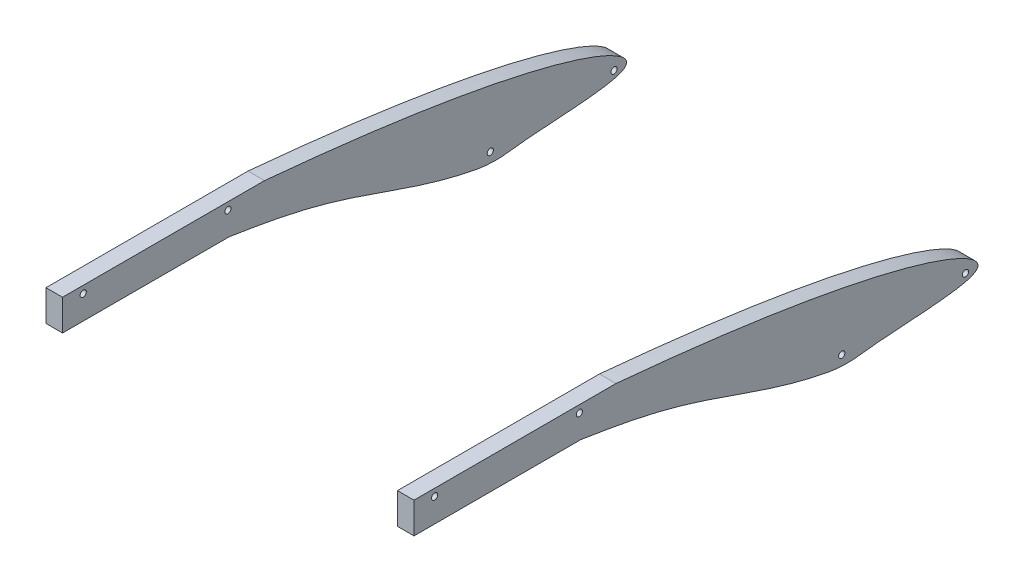
ISO-10303-21;
HEADER;
FILE_DESCRIPTION(('STEP AP214'),'2;1');
FILE_NAME('part.step','',(''),(''),'','','');
FILE_SCHEMA(('AUTOMOTIVE_DESIGN { 1 0 10303 214 1 1 1 1 }'));
ENDSEC;
DATA;
#1=APPLICATION_CONTEXT('core data for automotive mechanical design processes');
#2=APPLICATION_PROTOCOL_DEFINITION('international standard','automotive_design',2000,#1);
#3=PRODUCT_CONTEXT('',#1,'mechanical');
#4=PRODUCT('Part','Part','',(#3));
#5=PRODUCT_RELATED_PRODUCT_CATEGORY('part','',(#4));
#6=PRODUCT_DEFINITION_FORMATION('','',#4);
#7=PRODUCT_DEFINITION_CONTEXT('part definition',#1,'design');
#8=PRODUCT_DEFINITION('design','',#6,#7);
#9=PRODUCT_DEFINITION_SHAPE('','',#8);
#10=(LENGTH_UNIT() NAMED_UNIT(*) SI_UNIT(.MILLI.,.METRE.));
#11=(NAMED_UNIT(*) PLANE_ANGLE_UNIT() SI_UNIT($,.RADIAN.));
#12=(NAMED_UNIT(*) SI_UNIT($,.STERADIAN.) SOLID_ANGLE_UNIT());
#13=UNCERTAINTY_MEASURE_WITH_UNIT(LENGTH_MEASURE(1.E-05),#10,'distance_accuracy_value','');
#14=(GEOMETRIC_REPRESENTATION_CONTEXT(3) GLOBAL_UNCERTAINTY_ASSIGNED_CONTEXT((#13)) GLOBAL_UNIT_ASSIGNED_CONTEXT((#10,
#11,#12)) REPRESENTATION_CONTEXT('',''));
#15=CARTESIAN_POINT('',(0.,0.,0.));
#16=DIRECTION('',(0.,0.,1.));
#17=DIRECTION('',(1.,0.,0.));
#18=AXIS2_PLACEMENT_3D('',#15,#16,#17);
#19=CARTESIAN_POINT('',(162.,184.,240.000000000118));
#20=DIRECTION('',(0.,1.,0.));
#21=DIRECTION('',(0.,0.,1.));
#22=AXIS2_PLACEMENT_3D('',#19,#20,#21);
#23=PLANE('',#22);
#24=DIRECTION('',(1.,0.,0.));
#25=VECTOR('',#24,1.);
#26=CARTESIAN_POINT('',(162.,184.,44.5807056449326));
#27=LINE('',#26,#25);
#28=CARTESIAN_POINT('',(162.,184.,44.5807056449326));
#29=VERTEX_POINT('',#28);
#30=CARTESIAN_POINT('',(178.,184.,44.5807056449326));
#31=VERTEX_POINT('',#30);
#32=EDGE_CURVE('E46',#29,#31,#27,.T.);
#33=ORIENTED_EDGE('',*,*,#32,.F.);
#34=DIRECTION('',(0.,0.,-1.));
#35=VECTOR('',#34,1.);
#36=CARTESIAN_POINT('',(162.,184.,240.000000000118));
#37=LINE('',#36,#35);
#38=CARTESIAN_POINT('',(162.,184.,240.000000000118));
#39=VERTEX_POINT('',#38);
#40=EDGE_CURVE('E153',#39,#29,#37,.T.);
#41=ORIENTED_EDGE('',*,*,#40,.F.);
#42=DIRECTION('',(1.,0.,0.));
#43=VECTOR('',#42,1.);
#44=CARTESIAN_POINT('',(162.,184.,240.000000000118));
#45=LINE('',#44,#43);
#46=CARTESIAN_POINT('',(178.,184.,240.000000000118));
#47=VERTEX_POINT('',#46);
#48=EDGE_CURVE('E12',#39,#47,#45,.T.);
#49=ORIENTED_EDGE('',*,*,#48,.T.);
#50=DIRECTION('',(0.,0.,-1.));
#51=VECTOR('',#50,1.);
#52=CARTESIAN_POINT('',(178.,184.,240.000000000118));
#53=LINE('',#52,#51);
#54=EDGE_CURVE('E101',#47,#31,#53,.T.);
#55=ORIENTED_EDGE('',*,*,#54,.T.);
#56=EDGE_LOOP('',(#33,#41,#49,#55));
#57=FACE_BOUND('',#56,.T.);
#58=ADVANCED_FACE('F43',(#57),#23,.T.);
#59=CARTESIAN_POINT('',(162.,184.,240.000000000118));
#60=DIRECTION('',(0.,0.,-1.));
#61=DIRECTION('',(1.,0.,0.));
#62=AXIS2_PLACEMENT_3D('',#59,#60,#61);
#63=PLANE('',#62);
#64=ORIENTED_EDGE('',*,*,#48,.F.);
#65=DIRECTION('',(0.,-1.,0.));
#66=VECTOR('',#65,1.);
#67=CARTESIAN_POINT('',(162.,184.,240.000000000118));
#68=LINE('',#67,#66);
#69=CARTESIAN_POINT('',(162.,154.,240.000000000118));
#70=VERTEX_POINT('',#69);
#71=EDGE_CURVE('E59',#39,#70,#68,.T.);
#72=ORIENTED_EDGE('',*,*,#71,.T.);
#73=DIRECTION('',(1.,0.,0.));
#74=VECTOR('',#73,1.);
#75=CARTESIAN_POINT('',(162.,154.,240.000000000118));
#76=LINE('',#75,#74);
#77=CARTESIAN_POINT('',(178.,154.,240.000000000118));
#78=VERTEX_POINT('',#77);
#79=EDGE_CURVE('E51',#70,#78,#76,.T.);
#80=ORIENTED_EDGE('',*,*,#79,.T.);
#81=DIRECTION('',(0.,-1.,0.));
#82=VECTOR('',#81,1.);
#83=CARTESIAN_POINT('',(178.,184.,240.000000000118));
#84=LINE('',#83,#82);
#85=EDGE_CURVE('E144',#47,#78,#84,.T.);
#86=ORIENTED_EDGE('',*,*,#85,.F.);
#87=EDGE_LOOP('',(#64,#72,#80,#86));
#88=FACE_BOUND('',#87,.T.);
#89=ADVANCED_FACE('F189',(#88),#63,.F.);
#90=CARTESIAN_POINT('',(162.,154.,240.000000000118));
#91=DIRECTION('',(0.,1.,0.));
#92=DIRECTION('',(0.,0.,1.));
#93=AXIS2_PLACEMENT_3D('',#90,#91,#92);
#94=PLANE('',#93);
#95=ORIENTED_EDGE('',*,*,#79,.F.);
#96=DIRECTION('',(0.,0.,-1.));
#97=VECTOR('',#96,1.);
#98=CARTESIAN_POINT('',(162.,154.,240.000000000118));
#99=LINE('',#98,#97);
#100=CARTESIAN_POINT('',(162.,154.,78.7799428759968));
#101=VERTEX_POINT('',#100);
#102=EDGE_CURVE('E64',#70,#101,#99,.T.);
#103=ORIENTED_EDGE('',*,*,#102,.T.);
#104=DIRECTION('',(1.,0.,0.));
#105=VECTOR('',#104,1.);
#106=CARTESIAN_POINT('',(162.,154.,78.7799428759968));
#107=LINE('',#106,#105);
#108=CARTESIAN_POINT('',(178.,154.,78.7799428759968));
#109=VERTEX_POINT('',#108);
#110=EDGE_CURVE('E126',#101,#109,#107,.T.);
#111=ORIENTED_EDGE('',*,*,#110,.T.);
#112=DIRECTION('',(0.,0.,-1.));
#113=VECTOR('',#112,1.);
#114=CARTESIAN_POINT('',(178.,154.,240.000000000118));
#115=LINE('',#114,#113);
#116=EDGE_CURVE('E142',#78,#109,#115,.T.);
#117=ORIENTED_EDGE('',*,*,#116,.F.);
#118=EDGE_LOOP('',(#95,#103,#111,#117));
#119=FACE_BOUND('',#118,.T.);
#120=ADVANCED_FACE('F169',(#119),#94,.F.);
#121=CARTESIAN_POINT('',(162.,90.7808292595924,-161.09284313333));
#122=CARTESIAN_POINT('',(162.,103.326483389287,-92.5189432075794));
#123=CARTESIAN_POINT('',(162.,130.858776096243,-43.1516900653604));
#124=CARTESIAN_POINT('',(162.,141.508864751475,-1.80539436704717));
#125=CARTESIAN_POINT('',(162.,154.,78.7799428759968));
#126=B_SPLINE_CURVE_WITH_KNOTS('',4,(#121,#122,#123,#124,#125),.UNSPECIFIED.,.F.,.F.,(5,5),(0.,
1.),.UNSPECIFIED.);
#127=DIRECTION('',(1.,0.,0.));
#128=VECTOR('',#127,1.);
#129=SURFACE_OF_LINEAR_EXTRUSION('',#126,#128);
#130=ORIENTED_EDGE('',*,*,#110,.F.);
#131=CARTESIAN_POINT('',(162.,90.7808292595924,-161.09284313333));
#132=VERTEX_POINT('',#131);
#133=EDGE_CURVE('E121',#132,#101,#126,.T.);
#134=ORIENTED_EDGE('',*,*,#133,.F.);
#135=DIRECTION('',(1.,0.,0.));
#136=VECTOR('',#135,1.);
#137=CARTESIAN_POINT('',(162.,90.7808292595924,-161.09284313333));
#138=LINE('',#137,#136);
#139=CARTESIAN_POINT('',(178.,90.7808292595924,-161.09284313333));
#140=VERTEX_POINT('',#139);
#141=EDGE_CURVE('E117',#132,#140,#138,.T.);
#142=ORIENTED_EDGE('',*,*,#141,.T.);
#143=CARTESIAN_POINT('',(178.,90.7808292595924,-161.09284313333));
#144=CARTESIAN_POINT('',(178.,103.326483389287,-92.5189432075794));
#145=CARTESIAN_POINT('',(178.,130.858776096243,-43.1516900653604));
#146=CARTESIAN_POINT('',(178.,141.508864751475,-1.80539436704717));
#147=CARTESIAN_POINT('',(178.,154.,78.7799428759968));
#148=B_SPLINE_CURVE_WITH_KNOTS('',4,(#143,#144,#145,#146,#147),.UNSPECIFIED.,.F.,.F.,(5,5),(0.,
1.),.UNSPECIFIED.);
#149=EDGE_CURVE('E135',#140,#109,#148,.T.);
#150=ORIENTED_EDGE('',*,*,#149,.T.);
#151=EDGE_LOOP('',(#130,#134,#142,#150));
#152=FACE_BOUND('',#151,.T.);
#153=ADVANCED_FACE('F134',(#152),#129,.F.);
#154=CARTESIAN_POINT('',(162.,189.148151453253,-179.08922956085));
#155=DIRECTION('',(1.,0.,0.));
#156=DIRECTION('',(0.,0.,1.));
#157=AXIS2_PLACEMENT_3D('',#154,#155,#156);
#158=CYLINDRICAL_SURFACE('',#157,100.);
#159=ORIENTED_EDGE('',*,*,#141,.F.);
#160=CARTESIAN_POINT('',(162.,189.148151453253,-179.08922956085));
#161=DIRECTION('',(-1.,0.,0.));
#162=DIRECTION('',(0.,0.,1.));
#163=AXIS2_PLACEMENT_3D('',#160,#161,#162);
#164=CIRCLE('',#163,100.);
#165=CARTESIAN_POINT('',(162.,90.1430195181155,-193.159902981339));
#166=VERTEX_POINT('',#165);
#167=EDGE_CURVE('E140',#166,#132,#164,.T.);
#168=ORIENTED_EDGE('',*,*,#167,.F.);
#169=DIRECTION('',(1.,0.,0.));
#170=VECTOR('',#169,1.);
#171=CARTESIAN_POINT('',(162.,90.1430195181155,-193.159902981339));
#172=LINE('',#171,#170);
#173=CARTESIAN_POINT('',(178.,90.1430195181155,-193.159902981339));
#174=VERTEX_POINT('',#173);
#175=EDGE_CURVE('E116',#166,#174,#172,.T.);
#176=ORIENTED_EDGE('',*,*,#175,.T.);
#177=CARTESIAN_POINT('',(178.,189.148151453253,-179.08922956085));
#178=DIRECTION('',(-1.,0.,0.));
#179=DIRECTION('',(0.,0.,1.));
#180=AXIS2_PLACEMENT_3D('',#177,#178,#179);
#181=CIRCLE('',#180,100.);
#182=EDGE_CURVE('E103',#174,#140,#181,.T.);
#183=ORIENTED_EDGE('',*,*,#182,.T.);
#184=EDGE_LOOP('',(#159,#168,#176,#183));
#185=FACE_BOUND('',#184,.T.);
#186=ADVANCED_FACE('F139',(#185),#158,.T.);
#187=CARTESIAN_POINT('',(162.,184.,44.5807056449326));
#188=CARTESIAN_POINT('',(162.,174.527100953056,-57.7679798515222));
#189=CARTESIAN_POINT('',(162.,149.248640344591,-305.521879124602));
#190=CARTESIAN_POINT('',(162.,116.120839414258,-306.889667666517));
#191=CARTESIAN_POINT('',(162.,107.106894680746,-325.983667032139));
#192=CARTESIAN_POINT('',(162.,102.442751762721,-312.443719398681));
#193=CARTESIAN_POINT('',(162.,94.8105876029087,-318.808841179586));
#194=CARTESIAN_POINT('',(162.,96.0575753603031,-234.776346202943));
#195=CARTESIAN_POINT('',(162.,90.1430195181155,-193.159902981339));
#196=B_SPLINE_CURVE_WITH_KNOTS('',8,(#187,#188,#189,#190,#191,#192,#193,#194,#195),
.UNSPECIFIED.,.F.,.F.,(9,9),(0.,1.),.UNSPECIFIED.);
#197=DIRECTION('',(1.,0.,0.));
#198=VECTOR('',#197,1.);
#199=SURFACE_OF_LINEAR_EXTRUSION('',#196,#198);
#200=ORIENTED_EDGE('',*,*,#175,.F.);
#201=EDGE_CURVE('E115',#29,#166,#196,.T.);
#202=ORIENTED_EDGE('',*,*,#201,.F.);
#203=ORIENTED_EDGE('',*,*,#32,.T.);
#204=CARTESIAN_POINT('',(178.,184.,44.5807056449326));
#205=CARTESIAN_POINT('',(178.,174.527100953056,-57.7679798515222));
#206=CARTESIAN_POINT('',(178.,149.248640344591,-305.521879124602));
#207=CARTESIAN_POINT('',(178.,116.120839414258,-306.889667666517));
#208=CARTESIAN_POINT('',(178.,107.106894680746,-325.983667032139));
#209=CARTESIAN_POINT('',(178.,102.442751762721,-312.443719398681));
#210=CARTESIAN_POINT('',(178.,94.8105876029087,-318.808841179586));
#211=CARTESIAN_POINT('',(178.,96.0575753603031,-234.776346202943));
#212=CARTESIAN_POINT('',(178.,90.1430195181155,-193.159902981339));
#213=B_SPLINE_CURVE_WITH_KNOTS('',8,(#204,#205,#206,#207,#208,#209,#210,#211,#212),
.UNSPECIFIED.,.F.,.F.,(9,9),(0.,1.),.UNSPECIFIED.);
#214=EDGE_CURVE('E97',#31,#174,#213,.T.);
#215=ORIENTED_EDGE('',*,*,#214,.T.);
#216=EDGE_LOOP('',(#200,#202,#203,#215));
#217=FACE_BOUND('',#216,.T.);
#218=ADVANCED_FACE('F114',(#217),#199,.F.);
#219=CARTESIAN_POINT('',(162.,113.318447445774,-302.62390758668));
#220=DIRECTION('',(-1.,0.,0.));
#221=DIRECTION('',(0.,0.,-1.));
#222=AXIS2_PLACEMENT_3D('',#219,#220,#221);
#223=PLANE('',#222);
#224=CARTESIAN_POINT('',(162.,107.310137802413,-293.546030236577));
#225=DIRECTION('',(-1.,0.,0.));
#226=DIRECTION('',(0.,0.,1.));
#227=AXIS2_PLACEMENT_3D('',#224,#225,#226);
#228=CIRCLE('',#227,2.99999999999999);
#229=CARTESIAN_POINT('',(162.,107.310137802413,-290.546030236577));
#230=VERTEX_POINT('',#229);
#231=EDGE_CURVE('E112',#230,#230,#228,.T.);
#232=ORIENTED_EDGE('',*,*,#231,.F.);
#233=EDGE_LOOP('',(#232));
#234=FACE_BOUND('',#233,.T.);
#235=CARTESIAN_POINT('',(162.,177.,80.0000000001181));
#236=DIRECTION('',(-1.,0.,0.));
#237=DIRECTION('',(0.,0.,1.));
#238=AXIS2_PLACEMENT_3D('',#235,#236,#237);
#239=CIRCLE('',#238,3.00000000000001);
#240=CARTESIAN_POINT('',(162.,177.,83.0000000001181));
#241=VERTEX_POINT('',#240);
#242=EDGE_CURVE('E279',#241,#241,#239,.T.);
#243=ORIENTED_EDGE('',*,*,#242,.F.);
#244=EDGE_LOOP('',(#243));
#245=FACE_BOUND('',#244,.T.);
#246=CARTESIAN_POINT('',(162.,177.,220.000000000118));
#247=DIRECTION('',(-1.,0.,0.));
#248=DIRECTION('',(0.,0.,1.));
#249=AXIS2_PLACEMENT_3D('',#246,#247,#248);
#250=CIRCLE('',#249,2.99999999999999);
#251=CARTESIAN_POINT('',(162.,177.,223.000000000118));
#252=VERTEX_POINT('',#251);
#253=EDGE_CURVE('E284',#252,#252,#250,.T.);
#254=ORIENTED_EDGE('',*,*,#253,.F.);
#255=EDGE_LOOP('',(#254));
#256=FACE_BOUND('',#255,.T.);
#257=CARTESIAN_POINT('',(162.,98.9393609531192,-173.838344205398));
#258=DIRECTION('',(-1.,0.,0.));
#259=DIRECTION('',(0.,0.,1.));
#260=AXIS2_PLACEMENT_3D('',#257,#258,#259);
#261=CIRCLE('',#260,2.99999999999999);
#262=CARTESIAN_POINT('',(162.,98.9393609531192,-170.838344205398));
#263=VERTEX_POINT('',#262);
#264=EDGE_CURVE('E269',#263,#263,#261,.T.);
#265=ORIENTED_EDGE('',*,*,#264,.F.);
#266=EDGE_LOOP('',(#265));
#267=FACE_BOUND('',#266,.T.);
#268=ORIENTED_EDGE('',*,*,#40,.T.);
#269=ORIENTED_EDGE('',*,*,#201,.T.);
#270=ORIENTED_EDGE('',*,*,#167,.T.);
#271=ORIENTED_EDGE('',*,*,#133,.T.);
#272=ORIENTED_EDGE('',*,*,#102,.F.);
#273=ORIENTED_EDGE('',*,*,#71,.F.);
#274=EDGE_LOOP('',(#268,#269,#270,#271,#272,#273));
#275=FACE_BOUND('',#274,.T.);
#276=ADVANCED_FACE('F164',(#234,#245,#256,#267,#275),#223,.T.);
#277=CARTESIAN_POINT('',(178.,113.318447445774,-302.62390758668));
#278=DIRECTION('',(-1.,0.,0.));
#279=DIRECTION('',(0.,0.,-1.));
#280=AXIS2_PLACEMENT_3D('',#277,#278,#279);
#281=PLANE('',#280);
#282=CARTESIAN_POINT('',(178.,107.310137802413,-293.546030236577));
#283=DIRECTION('',(-1.,0.,0.));
#284=DIRECTION('',(0.,0.,1.));
#285=AXIS2_PLACEMENT_3D('',#282,#283,#284);
#286=CIRCLE('',#285,2.99999999999999);
#287=CARTESIAN_POINT('',(178.,107.310137802413,-290.546030236577));
#288=VERTEX_POINT('',#287);
#289=EDGE_CURVE('E268',#288,#288,#286,.T.);
#290=ORIENTED_EDGE('',*,*,#289,.T.);
#291=EDGE_LOOP('',(#290));
#292=FACE_BOUND('',#291,.T.);
#293=CARTESIAN_POINT('',(178.,177.,80.0000000001181));
#294=DIRECTION('',(-1.,0.,0.));
#295=DIRECTION('',(0.,0.,1.));
#296=AXIS2_PLACEMENT_3D('',#293,#294,#295);
#297=CIRCLE('',#296,3.00000000000001);
#298=CARTESIAN_POINT('',(178.,177.,83.0000000001181));
#299=VERTEX_POINT('',#298);
#300=EDGE_CURVE('E276',#299,#299,#297,.T.);
#301=ORIENTED_EDGE('',*,*,#300,.T.);
#302=EDGE_LOOP('',(#301));
#303=FACE_BOUND('',#302,.T.);
#304=CARTESIAN_POINT('',(178.,177.,220.000000000118));
#305=DIRECTION('',(-1.,0.,0.));
#306=DIRECTION('',(0.,0.,1.));
#307=AXIS2_PLACEMENT_3D('',#304,#305,#306);
#308=CIRCLE('',#307,2.99999999999999);
#309=CARTESIAN_POINT('',(178.,177.,223.000000000118));
#310=VERTEX_POINT('',#309);
#311=EDGE_CURVE('E282',#310,#310,#308,.T.);
#312=ORIENTED_EDGE('',*,*,#311,.T.);
#313=EDGE_LOOP('',(#312));
#314=FACE_BOUND('',#313,.T.);
#315=CARTESIAN_POINT('',(178.,98.9393609531192,-173.838344205398));
#316=DIRECTION('',(-1.,0.,0.));
#317=DIRECTION('',(0.,0.,1.));
#318=AXIS2_PLACEMENT_3D('',#315,#316,#317);
#319=CIRCLE('',#318,2.99999999999999);
#320=CARTESIAN_POINT('',(178.,98.9393609531192,-170.838344205398));
#321=VERTEX_POINT('',#320);
#322=EDGE_CURVE('E273',#321,#321,#319,.T.);
#323=ORIENTED_EDGE('',*,*,#322,.T.);
#324=EDGE_LOOP('',(#323));
#325=FACE_BOUND('',#324,.T.);
#326=ORIENTED_EDGE('',*,*,#54,.F.);
#327=ORIENTED_EDGE('',*,*,#85,.T.);
#328=ORIENTED_EDGE('',*,*,#116,.T.);
#329=ORIENTED_EDGE('',*,*,#149,.F.);
#330=ORIENTED_EDGE('',*,*,#182,.F.);
#331=ORIENTED_EDGE('',*,*,#214,.F.);
#332=EDGE_LOOP('',(#326,#327,#328,#329,#330,#331));
#333=FACE_BOUND('',#332,.T.);
#334=ADVANCED_FACE('F99',(#292,#303,#314,#325,#333),#281,.F.);
#335=CARTESIAN_POINT('',(162.,98.9393609531192,-173.838344205398));
#336=DIRECTION('',(1.,0.,0.));
#337=DIRECTION('',(0.,0.,1.));
#338=AXIS2_PLACEMENT_3D('',#335,#336,#337);
#339=CYLINDRICAL_SURFACE('',#338,2.99999999999999);
#340=ORIENTED_EDGE('',*,*,#264,.T.);
#341=EDGE_LOOP('',(#340));
#342=FACE_BOUND('',#341,.T.);
#343=ORIENTED_EDGE('',*,*,#322,.F.);
#344=EDGE_LOOP('',(#343));
#345=FACE_BOUND('',#344,.T.);
#346=ADVANCED_FACE('F183',(#342,#345),#339,.F.);
#347=CARTESIAN_POINT('',(162.,177.,220.000000000118));
#348=DIRECTION('',(1.,0.,0.));
#349=DIRECTION('',(0.,0.,1.));
#350=AXIS2_PLACEMENT_3D('',#347,#348,#349);
#351=CYLINDRICAL_SURFACE('',#350,2.99999999999999);
#352=ORIENTED_EDGE('',*,*,#253,.T.);
#353=EDGE_LOOP('',(#352));
#354=FACE_BOUND('',#353,.T.);
#355=ORIENTED_EDGE('',*,*,#311,.F.);
#356=EDGE_LOOP('',(#355));
#357=FACE_BOUND('',#356,.T.);
#358=ADVANCED_FACE('F230',(#354,#357),#351,.F.);
#359=CARTESIAN_POINT('',(162.,177.,80.0000000001181));
#360=DIRECTION('',(1.,0.,0.));
#361=DIRECTION('',(0.,0.,1.));
#362=AXIS2_PLACEMENT_3D('',#359,#360,#361);
#363=CYLINDRICAL_SURFACE('',#362,3.00000000000001);
#364=ORIENTED_EDGE('',*,*,#242,.T.);
#365=EDGE_LOOP('',(#364));
#366=FACE_BOUND('',#365,.T.);
#367=ORIENTED_EDGE('',*,*,#300,.F.);
#368=EDGE_LOOP('',(#367));
#369=FACE_BOUND('',#368,.T.);
#370=ADVANCED_FACE('F240',(#366,#369),#363,.F.);
#371=CARTESIAN_POINT('',(162.,107.310137802413,-293.546030236577));
#372=DIRECTION('',(1.,0.,0.));
#373=DIRECTION('',(0.,0.,1.));
#374=AXIS2_PLACEMENT_3D('',#371,#372,#373);
#375=CYLINDRICAL_SURFACE('',#374,2.99999999999999);
#376=ORIENTED_EDGE('',*,*,#231,.T.);
#377=EDGE_LOOP('',(#376));
#378=FACE_BOUND('',#377,.T.);
#379=ORIENTED_EDGE('',*,*,#289,.F.);
#380=EDGE_LOOP('',(#379));
#381=FACE_BOUND('',#380,.T.);
#382=ADVANCED_FACE('F250',(#378,#381),#375,.F.);
#383=CLOSED_SHELL('',(#58,#89,#120,#153,#186,#218,#276,#334,#346,#358,#370,#382));
#384=MANIFOLD_SOLID_BREP('B2',#383);
#385=CARTESIAN_POINT('',(-162.,184.,240.000000000118));
#386=DIRECTION('',(0.,1.,0.));
#387=DIRECTION('',(0.,0.,1.));
#388=AXIS2_PLACEMENT_3D('',#385,#386,#387);
#389=PLANE('',#388);
#390=DIRECTION('',(-1.,0.,0.));
#391=VECTOR('',#390,1.);
#392=CARTESIAN_POINT('',(-162.,184.,44.5807056449326));
#393=LINE('',#392,#391);
#394=CARTESIAN_POINT('',(-162.,184.,44.5807056449326));
#395=VERTEX_POINT('',#394);
#396=CARTESIAN_POINT('',(-178.,184.,44.5807056449326));
#397=VERTEX_POINT('',#396);
#398=EDGE_CURVE('E328',#395,#397,#393,.T.);
#399=ORIENTED_EDGE('',*,*,#398,.T.);
#400=DIRECTION('',(0.,0.,-1.));
#401=VECTOR('',#400,1.);
#402=CARTESIAN_POINT('',(-178.,184.,240.000000000118));
#403=LINE('',#402,#401);
#404=CARTESIAN_POINT('',(-178.,184.,240.000000000118));
#405=VERTEX_POINT('',#404);
#406=EDGE_CURVE('E377',#405,#397,#403,.T.);
#407=ORIENTED_EDGE('',*,*,#406,.F.);
#408=DIRECTION('',(-1.,0.,0.));
#409=VECTOR('',#408,1.);
#410=CARTESIAN_POINT('',(-162.,184.,240.000000000118));
#411=LINE('',#410,#409);
#412=CARTESIAN_POINT('',(-162.,184.,240.000000000118));
#413=VERTEX_POINT('',#412);
#414=EDGE_CURVE('E41',#413,#405,#411,.T.);
#415=ORIENTED_EDGE('',*,*,#414,.F.);
#416=DIRECTION('',(0.,0.,-1.));
#417=VECTOR('',#416,1.);
#418=CARTESIAN_POINT('',(-162.,184.,240.000000000118));
#419=LINE('',#418,#417);
#420=EDGE_CURVE('E379',#413,#395,#419,.T.);
#421=ORIENTED_EDGE('',*,*,#420,.T.);
#422=EDGE_LOOP('',(#399,#407,#415,#421));
#423=FACE_BOUND('',#422,.T.);
#424=ADVANCED_FACE('F325',(#423),#389,.T.);
#425=CARTESIAN_POINT('',(-162.,184.,240.000000000118));
#426=DIRECTION('',(0.,0.,-1.));
#427=DIRECTION('',(-1.,0.,0.));
#428=AXIS2_PLACEMENT_3D('',#425,#426,#427);
#429=PLANE('',#428);
#430=ORIENTED_EDGE('',*,*,#414,.T.);
#431=DIRECTION('',(0.,-1.,0.));
#432=VECTOR('',#431,1.);
#433=CARTESIAN_POINT('',(-178.,184.,240.000000000118));
#434=LINE('',#433,#432);
#435=CARTESIAN_POINT('',(-178.,154.,240.000000000118));
#436=VERTEX_POINT('',#435);
#437=EDGE_CURVE('E395',#405,#436,#434,.T.);
#438=ORIENTED_EDGE('',*,*,#437,.T.);
#439=DIRECTION('',(-1.,0.,0.));
#440=VECTOR('',#439,1.);
#441=CARTESIAN_POINT('',(-162.,154.,240.000000000118));
#442=LINE('',#441,#440);
#443=CARTESIAN_POINT('',(-162.,154.,240.000000000118));
#444=VERTEX_POINT('',#443);
#445=EDGE_CURVE('E333',#444,#436,#442,.T.);
#446=ORIENTED_EDGE('',*,*,#445,.F.);
#447=DIRECTION('',(0.,-1.,0.));
#448=VECTOR('',#447,1.);
#449=CARTESIAN_POINT('',(-162.,184.,240.000000000118));
#450=LINE('',#449,#448);
#451=EDGE_CURVE('E346',#413,#444,#450,.T.);
#452=ORIENTED_EDGE('',*,*,#451,.F.);
#453=EDGE_LOOP('',(#430,#438,#446,#452));
#454=FACE_BOUND('',#453,.T.);
#455=ADVANCED_FACE('F471',(#454),#429,.F.);
#456=CARTESIAN_POINT('',(-162.,154.,240.000000000118));
#457=DIRECTION('',(0.,1.,0.));
#458=DIRECTION('',(0.,0.,1.));
#459=AXIS2_PLACEMENT_3D('',#456,#457,#458);
#460=PLANE('',#459);
#461=ORIENTED_EDGE('',*,*,#445,.T.);
#462=DIRECTION('',(0.,0.,-1.));
#463=VECTOR('',#462,1.);
#464=CARTESIAN_POINT('',(-178.,154.,240.000000000118));
#465=LINE('',#464,#463);
#466=CARTESIAN_POINT('',(-178.,154.,78.7799428759968));
#467=VERTEX_POINT('',#466);
#468=EDGE_CURVE('E416',#436,#467,#465,.T.);
#469=ORIENTED_EDGE('',*,*,#468,.T.);
#470=DIRECTION('',(-1.,0.,0.));
#471=VECTOR('',#470,1.);
#472=CARTESIAN_POINT('',(-162.,154.,78.7799428759968));
#473=LINE('',#472,#471);
#474=CARTESIAN_POINT('',(-162.,154.,78.7799428759968));
#475=VERTEX_POINT('',#474);
#476=EDGE_CURVE('E460',#475,#467,#473,.T.);
#477=ORIENTED_EDGE('',*,*,#476,.F.);
#478=DIRECTION('',(0.,0.,-1.));
#479=VECTOR('',#478,1.);
#480=CARTESIAN_POINT('',(-162.,154.,240.000000000118));
#481=LINE('',#480,#479);
#482=EDGE_CURVE('E453',#444,#475,#481,.T.);
#483=ORIENTED_EDGE('',*,*,#482,.F.);
#484=EDGE_LOOP('',(#461,#469,#477,#483));
#485=FACE_BOUND('',#484,.T.);
#486=ADVANCED_FACE('F444',(#485),#460,.F.);
#487=CARTESIAN_POINT('',(-162.,90.7808292595924,-161.09284313333));
#488=CARTESIAN_POINT('',(-162.,103.326483389287,-92.5189432075794));
#489=CARTESIAN_POINT('',(-162.,130.858776096243,-43.1516900653604));
#490=CARTESIAN_POINT('',(-162.,141.508864751475,-1.80539436704717));
#491=CARTESIAN_POINT('',(-162.,154.,78.7799428759968));
#492=B_SPLINE_CURVE_WITH_KNOTS('',4,(#487,#488,#489,#490,#491),.UNSPECIFIED.,.F.,.F.,(5,5),(0.,
1.),.UNSPECIFIED.);
#493=DIRECTION('',(-1.,0.,0.));
#494=VECTOR('',#493,1.);
#495=SURFACE_OF_LINEAR_EXTRUSION('',#492,#494);
#496=ORIENTED_EDGE('',*,*,#476,.T.);
#497=CARTESIAN_POINT('',(-178.,90.7808292595924,-161.09284313333));
#498=CARTESIAN_POINT('',(-178.,103.326483389287,-92.5189432075794));
#499=CARTESIAN_POINT('',(-178.,130.858776096243,-43.1516900653604));
#500=CARTESIAN_POINT('',(-178.,141.508864751475,-1.80539436704717));
#501=CARTESIAN_POINT('',(-178.,154.,78.7799428759968));
#502=B_SPLINE_CURVE_WITH_KNOTS('',4,(#497,#498,#499,#500,#501),.UNSPECIFIED.,.F.,.F.,(5,5),(0.,
1.),.UNSPECIFIED.);
#503=CARTESIAN_POINT('',(-178.,90.7808292595924,-161.09284313333));
#504=VERTEX_POINT('',#503);
#505=EDGE_CURVE('E411',#504,#467,#502,.T.);
#506=ORIENTED_EDGE('',*,*,#505,.F.);
#507=DIRECTION('',(-1.,0.,0.));
#508=VECTOR('',#507,1.);
#509=CARTESIAN_POINT('',(-162.,90.7808292595924,-161.09284313333));
#510=LINE('',#509,#508);
#511=CARTESIAN_POINT('',(-162.,90.7808292595924,-161.09284313333));
#512=VERTEX_POINT('',#511);
#513=EDGE_CURVE('E462',#512,#504,#510,.T.);
#514=ORIENTED_EDGE('',*,*,#513,.F.);
#515=EDGE_CURVE('E447',#512,#475,#492,.T.);
#516=ORIENTED_EDGE('',*,*,#515,.T.);
#517=EDGE_LOOP('',(#496,#506,#514,#516));
#518=FACE_BOUND('',#517,.T.);
#519=ADVANCED_FACE('F440',(#518),#495,.T.);
#520=CARTESIAN_POINT('',(-162.,189.148151453253,-179.08922956085));
#521=DIRECTION('',(-1.,0.,0.));
#522=DIRECTION('',(0.,0.,1.));
#523=AXIS2_PLACEMENT_3D('',#520,#521,#522);
#524=CYLINDRICAL_SURFACE('',#523,100.);
#525=ORIENTED_EDGE('',*,*,#513,.T.);
#526=CARTESIAN_POINT('',(-178.,189.148151453253,-179.08922956085));
#527=DIRECTION('',(-1.,0.,0.));
#528=DIRECTION('',(0.,0.,1.));
#529=AXIS2_PLACEMENT_3D('',#526,#527,#528);
#530=CIRCLE('',#529,100.);
#531=CARTESIAN_POINT('',(-178.,90.1430195181155,-193.159902981339));
#532=VERTEX_POINT('',#531);
#533=EDGE_CURVE('E390',#532,#504,#530,.T.);
#534=ORIENTED_EDGE('',*,*,#533,.F.);
#535=DIRECTION('',(-1.,0.,0.));
#536=VECTOR('',#535,1.);
#537=CARTESIAN_POINT('',(-162.,90.1430195181155,-193.159902981339));
#538=LINE('',#537,#536);
#539=CARTESIAN_POINT('',(-162.,90.1430195181155,-193.159902981339));
#540=VERTEX_POINT('',#539);
#541=EDGE_CURVE('E383',#540,#532,#538,.T.);
#542=ORIENTED_EDGE('',*,*,#541,.F.);
#543=CARTESIAN_POINT('',(-162.,189.148151453253,-179.08922956085));
#544=DIRECTION('',(-1.,0.,0.));
#545=DIRECTION('',(0.,0.,1.));
#546=AXIS2_PLACEMENT_3D('',#543,#544,#545);
#547=CIRCLE('',#546,100.);
#548=EDGE_CURVE('E429',#540,#512,#547,.T.);
#549=ORIENTED_EDGE('',*,*,#548,.T.);
#550=EDGE_LOOP('',(#525,#534,#542,#549));
#551=FACE_BOUND('',#550,.T.);
#552=ADVANCED_FACE('F437',(#551),#524,.T.);
#553=CARTESIAN_POINT('',(-162.,184.,44.5807056449326));
#554=CARTESIAN_POINT('',(-162.,174.527100953056,-57.7679798515222));
#555=CARTESIAN_POINT('',(-162.,149.248640344591,-305.521879124602));
#556=CARTESIAN_POINT('',(-162.,116.120839414258,-306.889667666517));
#557=CARTESIAN_POINT('',(-162.,107.106894680746,-325.983667032139));
#558=CARTESIAN_POINT('',(-162.,102.442751762721,-312.443719398681));
#559=CARTESIAN_POINT('',(-162.,94.8105876029087,-318.808841179586));
#560=CARTESIAN_POINT('',(-162.,96.0575753603031,-234.776346202943));
#561=CARTESIAN_POINT('',(-162.,90.1430195181155,-193.159902981339));
#562=B_SPLINE_CURVE_WITH_KNOTS('',8,(#553,#554,#555,#556,#557,#558,#559,#560,#561),
.UNSPECIFIED.,.F.,.F.,(9,9),(0.,1.),.UNSPECIFIED.);
#563=DIRECTION('',(-1.,0.,0.));
#564=VECTOR('',#563,1.);
#565=SURFACE_OF_LINEAR_EXTRUSION('',#562,#564);
#566=ORIENTED_EDGE('',*,*,#541,.T.);
#567=CARTESIAN_POINT('',(-178.,184.,44.5807056449326));
#568=CARTESIAN_POINT('',(-178.,174.527100953056,-57.7679798515222));
#569=CARTESIAN_POINT('',(-178.,149.248640344591,-305.521879124602));
#570=CARTESIAN_POINT('',(-178.,116.120839414258,-306.889667666517));
#571=CARTESIAN_POINT('',(-178.,107.106894680746,-325.983667032139));
#572=CARTESIAN_POINT('',(-178.,102.442751762721,-312.443719398681));
#573=CARTESIAN_POINT('',(-178.,94.8105876029087,-318.808841179586));
#574=CARTESIAN_POINT('',(-178.,96.0575753603031,-234.776346202943));
#575=CARTESIAN_POINT('',(-178.,90.1430195181155,-193.159902981339));
#576=B_SPLINE_CURVE_WITH_KNOTS('',8,(#567,#568,#569,#570,#571,#572,#573,#574,#575),
.UNSPECIFIED.,.F.,.F.,(9,9),(0.,1.),.UNSPECIFIED.);
#577=EDGE_CURVE('E385',#397,#532,#576,.T.);
#578=ORIENTED_EDGE('',*,*,#577,.F.);
#579=ORIENTED_EDGE('',*,*,#398,.F.);
#580=EDGE_CURVE('E424',#395,#540,#562,.T.);
#581=ORIENTED_EDGE('',*,*,#580,.T.);
#582=EDGE_LOOP('',(#566,#578,#579,#581));
#583=FACE_BOUND('',#582,.T.);
#584=ADVANCED_FACE('F386',(#583),#565,.T.);
#585=CARTESIAN_POINT('',(-162.,113.318447445774,-302.62390758668));
#586=DIRECTION('',(1.,0.,0.));
#587=DIRECTION('',(0.,0.,-1.));
#588=AXIS2_PLACEMENT_3D('',#585,#586,#587);
#589=PLANE('',#588);
#590=CARTESIAN_POINT('',(-162.,107.310137802413,-293.546030236577));
#591=DIRECTION('',(-1.,0.,0.));
#592=DIRECTION('',(0.,0.,1.));
#593=AXIS2_PLACEMENT_3D('',#590,#591,#592);
#594=CIRCLE('',#593,2.99999999999999);
#595=CARTESIAN_POINT('',(-162.,107.310137802413,-290.546030236577));
#596=VERTEX_POINT('',#595);
#597=EDGE_CURVE('E396',#596,#596,#594,.T.);
#598=ORIENTED_EDGE('',*,*,#597,.T.);
#599=EDGE_LOOP('',(#598));
#600=FACE_BOUND('',#599,.T.);
#601=CARTESIAN_POINT('',(-162.,177.,80.0000000001181));
#602=DIRECTION('',(-1.,0.,0.));
#603=DIRECTION('',(0.,0.,1.));
#604=AXIS2_PLACEMENT_3D('',#601,#602,#603);
#605=CIRCLE('',#604,3.00000000000001);
#606=CARTESIAN_POINT('',(-162.,177.,83.0000000001181));
#607=VERTEX_POINT('',#606);
#608=EDGE_CURVE('E569',#607,#607,#605,.T.);
#609=ORIENTED_EDGE('',*,*,#608,.T.);
#610=EDGE_LOOP('',(#609));
#611=FACE_BOUND('',#610,.T.);
#612=CARTESIAN_POINT('',(-162.,177.,220.000000000118));
#613=DIRECTION('',(-1.,0.,0.));
#614=DIRECTION('',(0.,0.,1.));
#615=AXIS2_PLACEMENT_3D('',#612,#613,#614);
#616=CIRCLE('',#615,2.99999999999999);
#617=CARTESIAN_POINT('',(-162.,177.,223.000000000118));
#618=VERTEX_POINT('',#617);
#619=EDGE_CURVE('E402',#618,#618,#616,.T.);
#620=ORIENTED_EDGE('',*,*,#619,.T.);
#621=EDGE_LOOP('',(#620));
#622=FACE_BOUND('',#621,.T.);
#623=CARTESIAN_POINT('',(-162.,98.9393609531192,-173.838344205398));
#624=DIRECTION('',(-1.,0.,0.));
#625=DIRECTION('',(0.,0.,1.));
#626=AXIS2_PLACEMENT_3D('',#623,#624,#625);
#627=CIRCLE('',#626,2.99999999999999);
#628=CARTESIAN_POINT('',(-162.,98.9393609531192,-170.838344205398));
#629=VERTEX_POINT('',#628);
#630=EDGE_CURVE('E560',#629,#629,#627,.T.);
#631=ORIENTED_EDGE('',*,*,#630,.T.);
#632=EDGE_LOOP('',(#631));
#633=FACE_BOUND('',#632,.T.);
#634=ORIENTED_EDGE('',*,*,#420,.F.);
#635=ORIENTED_EDGE('',*,*,#451,.T.);
#636=ORIENTED_EDGE('',*,*,#482,.T.);
#637=ORIENTED_EDGE('',*,*,#515,.F.);
#638=ORIENTED_EDGE('',*,*,#548,.F.);
#639=ORIENTED_EDGE('',*,*,#580,.F.);
#640=EDGE_LOOP('',(#634,#635,#636,#637,#638,#639));
#641=FACE_BOUND('',#640,.T.);
#642=ADVANCED_FACE('F436',(#600,#611,#622,#633,#641),#589,.T.);
#643=CARTESIAN_POINT('',(-178.,113.318447445774,-302.62390758668));
#644=DIRECTION('',(1.,0.,0.));
#645=DIRECTION('',(0.,0.,-1.));
#646=AXIS2_PLACEMENT_3D('',#643,#644,#645);
#647=PLANE('',#646);
#648=CARTESIAN_POINT('',(-178.,107.310137802413,-293.546030236577));
#649=DIRECTION('',(-1.,0.,0.));
#650=DIRECTION('',(0.,0.,1.));
#651=AXIS2_PLACEMENT_3D('',#648,#649,#650);
#652=CIRCLE('',#651,2.99999999999999);
#653=CARTESIAN_POINT('',(-178.,107.310137802413,-290.546030236577));
#654=VERTEX_POINT('',#653);
#655=EDGE_CURVE('E399',#654,#654,#652,.T.);
#656=ORIENTED_EDGE('',*,*,#655,.F.);
#657=EDGE_LOOP('',(#656));
#658=FACE_BOUND('',#657,.T.);
#659=CARTESIAN_POINT('',(-178.,177.,80.0000000001181));
#660=DIRECTION('',(-1.,0.,0.));
#661=DIRECTION('',(0.,0.,1.));
#662=AXIS2_PLACEMENT_3D('',#659,#660,#661);
#663=CIRCLE('',#662,3.00000000000001);
#664=CARTESIAN_POINT('',(-178.,177.,83.0000000001181));
#665=VERTEX_POINT('',#664);
#666=EDGE_CURVE('E566',#665,#665,#663,.T.);
#667=ORIENTED_EDGE('',*,*,#666,.F.);
#668=EDGE_LOOP('',(#667));
#669=FACE_BOUND('',#668,.T.);
#670=CARTESIAN_POINT('',(-178.,177.,220.000000000118));
#671=DIRECTION('',(-1.,0.,0.));
#672=DIRECTION('',(0.,0.,1.));
#673=AXIS2_PLACEMENT_3D('',#670,#671,#672);
#674=CIRCLE('',#673,2.99999999999999);
#675=CARTESIAN_POINT('',(-178.,177.,223.000000000118));
#676=VERTEX_POINT('',#675);
#677=EDGE_CURVE('E572',#676,#676,#674,.T.);
#678=ORIENTED_EDGE('',*,*,#677,.F.);
#679=EDGE_LOOP('',(#678));
#680=FACE_BOUND('',#679,.T.);
#681=CARTESIAN_POINT('',(-178.,98.9393609531192,-173.838344205398));
#682=DIRECTION('',(-1.,0.,0.));
#683=DIRECTION('',(0.,0.,1.));
#684=AXIS2_PLACEMENT_3D('',#681,#682,#683);
#685=CIRCLE('',#684,2.99999999999999);
#686=CARTESIAN_POINT('',(-178.,98.9393609531192,-170.838344205398));
#687=VERTEX_POINT('',#686);
#688=EDGE_CURVE('E563',#687,#687,#685,.T.);
#689=ORIENTED_EDGE('',*,*,#688,.F.);
#690=EDGE_LOOP('',(#689));
#691=FACE_BOUND('',#690,.T.);
#692=ORIENTED_EDGE('',*,*,#406,.T.);
#693=ORIENTED_EDGE('',*,*,#577,.T.);
#694=ORIENTED_EDGE('',*,*,#533,.T.);
#695=ORIENTED_EDGE('',*,*,#505,.T.);
#696=ORIENTED_EDGE('',*,*,#468,.F.);
#697=ORIENTED_EDGE('',*,*,#437,.F.);
#698=EDGE_LOOP('',(#692,#693,#694,#695,#696,#697));
#699=FACE_BOUND('',#698,.T.);
#700=ADVANCED_FACE('F392',(#658,#669,#680,#691,#699),#647,.F.);
#701=CARTESIAN_POINT('',(-162.,98.9393609531192,-173.838344205398));
#702=DIRECTION('',(-1.,0.,0.));
#703=DIRECTION('',(0.,0.,1.));
#704=AXIS2_PLACEMENT_3D('',#701,#702,#703);
#705=CYLINDRICAL_SURFACE('',#704,2.99999999999999);
#706=ORIENTED_EDGE('',*,*,#630,.F.);
#707=EDGE_LOOP('',(#706));
#708=FACE_BOUND('',#707,.T.);
#709=ORIENTED_EDGE('',*,*,#688,.T.);
#710=EDGE_LOOP('',(#709));
#711=FACE_BOUND('',#710,.T.);
#712=ADVANCED_FACE('F478',(#708,#711),#705,.F.);
#713=CARTESIAN_POINT('',(-162.,177.,220.000000000118));
#714=DIRECTION('',(-1.,0.,0.));
#715=DIRECTION('',(0.,0.,1.));
#716=AXIS2_PLACEMENT_3D('',#713,#714,#715);
#717=CYLINDRICAL_SURFACE('',#716,2.99999999999999);
#718=ORIENTED_EDGE('',*,*,#619,.F.);
#719=EDGE_LOOP('',(#718));
#720=FACE_BOUND('',#719,.T.);
#721=ORIENTED_EDGE('',*,*,#677,.T.);
#722=EDGE_LOOP('',(#721));
#723=FACE_BOUND('',#722,.T.);
#724=ADVANCED_FACE('F522',(#720,#723),#717,.F.);
#725=CARTESIAN_POINT('',(-162.,177.,80.0000000001181));
#726=DIRECTION('',(-1.,0.,0.));
#727=DIRECTION('',(0.,0.,1.));
#728=AXIS2_PLACEMENT_3D('',#725,#726,#727);
#729=CYLINDRICAL_SURFACE('',#728,3.00000000000001);
#730=ORIENTED_EDGE('',*,*,#608,.F.);
#731=EDGE_LOOP('',(#730));
#732=FACE_BOUND('',#731,.T.);
#733=ORIENTED_EDGE('',*,*,#666,.T.);
#734=EDGE_LOOP('',(#733));
#735=FACE_BOUND('',#734,.T.);
#736=ADVANCED_FACE('F532',(#732,#735),#729,.F.);
#737=CARTESIAN_POINT('',(-162.,107.310137802413,-293.546030236577));
#738=DIRECTION('',(-1.,0.,0.));
#739=DIRECTION('',(0.,0.,1.));
#740=AXIS2_PLACEMENT_3D('',#737,#738,#739);
#741=CYLINDRICAL_SURFACE('',#740,2.99999999999999);
#742=ORIENTED_EDGE('',*,*,#597,.F.);
#743=EDGE_LOOP('',(#742));
#744=FACE_BOUND('',#743,.T.);
#745=ORIENTED_EDGE('',*,*,#655,.T.);
#746=EDGE_LOOP('',(#745));
#747=FACE_BOUND('',#746,.T.);
#748=ADVANCED_FACE('F542',(#744,#747),#741,.F.);
#749=CLOSED_SHELL('',(#424,#455,#486,#519,#552,#584,#642,#700,#712,#724,#736,#748));
#750=MANIFOLD_SOLID_BREP('B6',#749);
#751=ADVANCED_BREP_SHAPE_REPRESENTATION('',(#18,#384,#750),#14);
#752=SHAPE_DEFINITION_REPRESENTATION(#9,#751);
ENDSEC;
END-ISO-10303-21;
